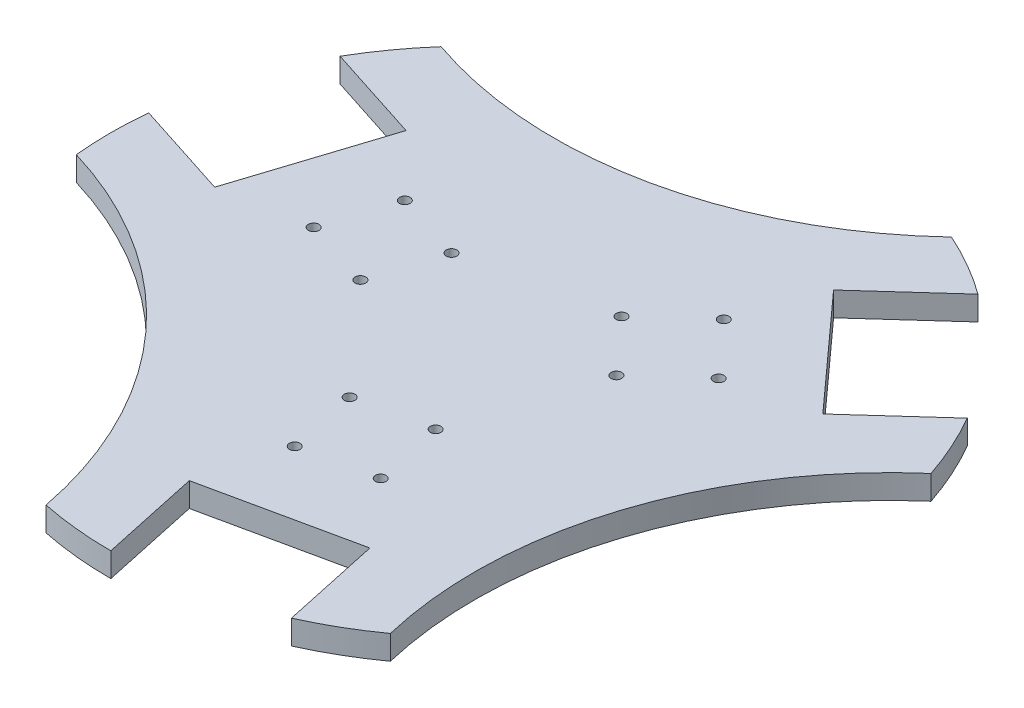
ISO-10303-21;
HEADER;
FILE_DESCRIPTION(('STEP AP214'),'2;1');
FILE_NAME('part.step','',(''),(''),'','','');
FILE_SCHEMA(('AUTOMOTIVE_DESIGN { 1 0 10303 214 1 1 1 1 }'));
ENDSEC;
DATA;
#1=APPLICATION_CONTEXT('core data for automotive mechanical design processes');
#2=APPLICATION_PROTOCOL_DEFINITION('international standard','automotive_design',2000,#1);
#3=PRODUCT_CONTEXT('',#1,'mechanical');
#4=PRODUCT('Part','Part','',(#3));
#5=PRODUCT_RELATED_PRODUCT_CATEGORY('part','',(#4));
#6=PRODUCT_DEFINITION_FORMATION('','',#4);
#7=PRODUCT_DEFINITION_CONTEXT('part definition',#1,'design');
#8=PRODUCT_DEFINITION('design','',#6,#7);
#9=PRODUCT_DEFINITION_SHAPE('','',#8);
#10=(LENGTH_UNIT() NAMED_UNIT(*) SI_UNIT(.MILLI.,.METRE.));
#11=(NAMED_UNIT(*) PLANE_ANGLE_UNIT() SI_UNIT($,.RADIAN.));
#12=(NAMED_UNIT(*) SI_UNIT($,.STERADIAN.) SOLID_ANGLE_UNIT());
#13=UNCERTAINTY_MEASURE_WITH_UNIT(LENGTH_MEASURE(1.E-05),#10,'distance_accuracy_value','');
#14=(GEOMETRIC_REPRESENTATION_CONTEXT(3) GLOBAL_UNCERTAINTY_ASSIGNED_CONTEXT((#13)) GLOBAL_UNIT_ASSIGNED_CONTEXT((#10,
#11,#12)) REPRESENTATION_CONTEXT('',''));
#15=CARTESIAN_POINT('',(0.,0.,0.));
#16=DIRECTION('',(0.,0.,1.));
#17=DIRECTION('',(1.,0.,0.));
#18=AXIS2_PLACEMENT_3D('',#15,#16,#17);
#19=CARTESIAN_POINT('',(254.887392455541,10.,82.1373974798932));
#20=DIRECTION('',(0.,-1.,0.));
#21=DIRECTION('',(0.,0.,-1.));
#22=AXIS2_PLACEMENT_3D('',#19,#20,#21);
#23=PLANE('',#22);
#24=CARTESIAN_POINT('',(254.887392455541,10.,82.1373974798932));
#25=DIRECTION('',(0.,-1.,0.));
#26=DIRECTION('',(0.,0.,-1.));
#27=AXIS2_PLACEMENT_3D('',#24,#25,#26);
#28=CIRCLE('',#27,171.9);
#29=CARTESIAN_POINT('',(87.6144388397631,10.,121.752659547105));
#30=VERTEX_POINT('',#29);
#31=CARTESIAN_POINT('',(142.217130056094,10.,-47.689494845387));
#32=VERTEX_POINT('',#31);
#33=EDGE_CURVE('E225',#30,#32,#28,.T.);
#34=ORIENTED_EDGE('',*,*,#33,.T.);
#35=CARTESIAN_POINT('',(0.,10.,0.));
#36=DIRECTION('',(0.,1.,0.));
#37=DIRECTION('',(0.,0.,1.));
#38=AXIS2_PLACEMENT_3D('',#35,#36,#37);
#39=CIRCLE('',#38,150.);
#40=CARTESIAN_POINT('',(129.882697804348,10.,-75.0365564979135));
#41=VERTEX_POINT('',#40);
#42=EDGE_CURVE('E123',#32,#41,#39,.T.);
#43=ORIENTED_EDGE('',*,*,#42,.T.);
#44=DIRECTION('',(-0.741525445225282,0.,0.6709247454696));
#45=VECTOR('',#44,1.);
#46=CARTESIAN_POINT('',(98.4642646901526,10.,-46.6094750323666));
#47=LINE('',#46,#45);
#48=CARTESIAN_POINT('',(98.4642646901526,10.,-46.6094750323666));
#49=VERTEX_POINT('',#48);
#50=EDGE_CURVE('E270',#41,#49,#47,.T.);
#51=ORIENTED_EDGE('',*,*,#50,.T.);
#52=DIRECTION('',(-0.6709247454696,0.,-0.741525445225282));
#53=VECTOR('',#52,1.);
#54=CARTESIAN_POINT('',(56.1960057255678,10.,-93.3255780815594));
#55=LINE('',#54,#53);
#56=CARTESIAN_POINT('',(56.1960057255678,10.,-93.3255780815594));
#57=VERTEX_POINT('',#56);
#58=EDGE_CURVE('E289',#49,#57,#55,.T.);
#59=ORIENTED_EDGE('',*,*,#58,.T.);
#60=DIRECTION('',(0.741525445225282,0.,-0.6709247454696));
#61=VECTOR('',#60,1.);
#62=CARTESIAN_POINT('',(87.614438839763,10.,-121.752659547106));
#63=LINE('',#62,#61);
#64=CARTESIAN_POINT('',(87.614438839763,10.,-121.752659547106));
#65=VERTEX_POINT('',#64);
#66=EDGE_CURVE('E286',#57,#65,#63,.T.);
#67=ORIENTED_EDGE('',*,*,#66,.T.);
#68=CARTESIAN_POINT('',(0.,10.,0.));
#69=DIRECTION('',(0.,1.,0.));
#70=DIRECTION('',(0.,0.,1.));
#71=AXIS2_PLACEMENT_3D('',#68,#69,#70);
#72=CIRCLE('',#71,150.000000000001);
#73=CARTESIAN_POINT('',(61.6336767262298,10.,-136.752659547106));
#74=VERTEX_POINT('',#73);
#75=EDGE_CURVE('E288',#65,#74,#72,.T.);
#76=ORIENTED_EDGE('',*,*,#75,.T.);
#77=CARTESIAN_POINT('',(-56.3106234094427,10.,-261.807655710819));
#78=DIRECTION('',(0.,-1.,0.));
#79=DIRECTION('',(0.,0.,1.));
#80=AXIS2_PLACEMENT_3D('',#77,#78,#79);
#81=CIRCLE('',#80,171.9);
#82=CARTESIAN_POINT('',(-112.408879057798,10.,-99.3189000592));
#83=VERTEX_POINT('',#82);
#84=EDGE_CURVE('E291',#74,#83,#81,.T.);
#85=ORIENTED_EDGE('',*,*,#84,.T.);
#86=CARTESIAN_POINT('',(0.,10.,0.));
#87=DIRECTION('',(0.,1.,0.));
#88=DIRECTION('',(0.,0.,1.));
#89=AXIS2_PLACEMENT_3D('',#86,#87,#88);
#90=CIRCLE('',#89,150.);
#91=CARTESIAN_POINT('',(-129.924913041873,10.,-74.9634375616666));
#92=VERTEX_POINT('',#91);
#93=EDGE_CURVE('E297',#83,#92,#90,.T.);
#94=ORIENTED_EDGE('',*,*,#93,.T.);
#95=DIRECTION('',(0.951800596216923,0.,0.306717500382859));
#96=VECTOR('',#95,1.);
#97=CARTESIAN_POINT('',(-89.5971217801617,10.,-61.9678170704449));
#98=LINE('',#97,#96);
#99=CARTESIAN_POINT('',(-89.5971217801617,10.,-61.9678170704449));
#100=VERTEX_POINT('',#99);
#101=EDGE_CURVE('E299',#92,#100,#98,.T.);
#102=ORIENTED_EDGE('',*,*,#101,.T.);
#103=DIRECTION('',(-0.306717500382859,0.,0.951800596216923));
#104=VECTOR('',#103,1.);
#105=CARTESIAN_POINT('',(-108.920324304282,10.,-2.00437950877862));
#106=LINE('',#105,#104);
#107=CARTESIAN_POINT('',(-108.920324304282,10.,-2.00437950877862));
#108=VERTEX_POINT('',#107);
#109=EDGE_CURVE('E301',#100,#108,#106,.T.);
#110=ORIENTED_EDGE('',*,*,#109,.T.);
#111=DIRECTION('',(-0.951800596216923,0.,-0.306717500382861));
#112=VECTOR('',#111,1.);
#113=CARTESIAN_POINT('',(-149.248115565993,10.,-15.0000000000004));
#114=LINE('',#113,#112);
#115=CARTESIAN_POINT('',(-149.248115565993,10.,-15.0000000000005));
#116=VERTEX_POINT('',#115);
#117=EDGE_CURVE('E303',#108,#116,#114,.T.);
#118=ORIENTED_EDGE('',*,*,#117,.T.);
#119=CARTESIAN_POINT('',(0.,10.,0.));
#120=DIRECTION('',(0.,1.,0.));
#121=DIRECTION('',(0.,0.,1.));
#122=AXIS2_PLACEMENT_3D('',#119,#120,#121);
#123=CIRCLE('',#122,150.);
#124=CARTESIAN_POINT('',(-149.248115565993,10.,14.9999999999995));
#125=VERTEX_POINT('',#124);
#126=EDGE_CURVE('E305',#116,#125,#123,.T.);
#127=ORIENTED_EDGE('',*,*,#126,.T.);
#128=CARTESIAN_POINT('',(-198.576769046098,10.,179.670258230926));
#129=DIRECTION('',(0.,-1.,0.));
#130=DIRECTION('',(0.,0.,1.));
#131=AXIS2_PLACEMENT_3D('',#128,#129,#130);
#132=CIRCLE('',#131,171.9);
#133=CARTESIAN_POINT('',(-29.8082509982954,10.,147.008394904585));
#134=VERTEX_POINT('',#133);
#135=EDGE_CURVE('E307',#125,#134,#132,.T.);
#136=ORIENTED_EDGE('',*,*,#135,.T.);
#137=CARTESIAN_POINT('',(0.,10.,0.));
#138=DIRECTION('',(0.,1.,0.));
#139=DIRECTION('',(0.,0.,1.));
#140=AXIS2_PLACEMENT_3D('',#137,#138,#139);
#141=CIRCLE('',#140,149.999999999999);
#142=CARTESIAN_POINT('',(0.0422152375249344,10.,149.999994059578));
#143=VERTEX_POINT('',#142);
#144=EDGE_CURVE('E309',#134,#143,#141,.T.);
#145=ORIENTED_EDGE('',*,*,#144,.T.);
#146=DIRECTION('',(-0.21027515099164,0.,-0.97764224585246));
#147=VECTOR('',#146,1.);
#148=CARTESIAN_POINT('',(0.0422152375249344,10.,149.999994059578));
#149=LINE('',#148,#147);
#150=CARTESIAN_POINT('',(-8.86714290999087,10.,108.57729210281));
#151=VERTEX_POINT('',#150);
#152=EDGE_CURVE('E172',#143,#151,#149,.T.);
#153=ORIENTED_EDGE('',*,*,#152,.T.);
#154=DIRECTION('',(0.977642245852461,0.,-0.21027515099164));
#155=VECTOR('',#154,1.);
#156=CARTESIAN_POINT('',(-8.86714290999087,10.,108.57729210281));
#157=LINE('',#156,#155);
#158=CARTESIAN_POINT('',(52.7243185787141,10.,95.3299575903362));
#159=VERTEX_POINT('',#158);
#160=EDGE_CURVE('E166',#151,#159,#157,.T.);
#161=ORIENTED_EDGE('',*,*,#160,.T.);
#162=DIRECTION('',(0.21027515099164,0.,0.977642245852461));
#163=VECTOR('',#162,1.);
#164=CARTESIAN_POINT('',(52.7243185787141,10.,95.3299575903362));
#165=LINE('',#164,#163);
#166=CARTESIAN_POINT('',(61.63367672623,10.,136.752659547105));
#167=VERTEX_POINT('',#166);
#168=EDGE_CURVE('E170',#159,#167,#165,.T.);
#169=ORIENTED_EDGE('',*,*,#168,.T.);
#170=CARTESIAN_POINT('',(0.,10.,0.));
#171=DIRECTION('',(0.,1.,0.));
#172=DIRECTION('',(0.,0.,1.));
#173=AXIS2_PLACEMENT_3D('',#170,#171,#172);
#174=CIRCLE('',#173,149.999999999999);
#175=EDGE_CURVE('E50',#167,#30,#174,.T.);
#176=ORIENTED_EDGE('',*,*,#175,.T.);
#177=EDGE_LOOP('',(#34,#43,#51,#59,#67,#76,#85,#94,#102,#110,#118,#127,#136,#145,#153,#161,#169,#176));
#178=FACE_BOUND('',#177,.T.);
#179=CARTESIAN_POINT('',(-5.57103079480401,10.,45.4334470668592));
#180=DIRECTION('',(0.,1.,0.));
#181=DIRECTION('',(0.,0.,1.));
#182=AXIS2_PLACEMENT_3D('',#179,#180,#181);
#183=CIRCLE('',#182,2.19999999999993);
#184=CARTESIAN_POINT('',(-5.57103079480401,10.,47.6334470668591));
#185=VERTEX_POINT('',#184);
#186=EDGE_CURVE('E194',#185,#185,#183,.T.);
#187=ORIENTED_EDGE('',*,*,#186,.F.);
#188=EDGE_LOOP('',(#187));
#189=FACE_BOUND('',#188,.T.);
#190=CARTESIAN_POINT('',(0.663417156947142,10.,74.4195620141388));
#191=DIRECTION('',(0.,1.,0.));
#192=DIRECTION('',(0.,0.,1.));
#193=AXIS2_PLACEMENT_3D('',#190,#191,#192);
#194=CIRCLE('',#193,2.19999999999991);
#195=CARTESIAN_POINT('',(0.663417156947142,10.,76.6195620141387));
#196=VERTEX_POINT('',#195);
#197=EDGE_CURVE('E453',#196,#196,#194,.T.);
#198=ORIENTED_EDGE('',*,*,#197,.F.);
#199=EDGE_LOOP('',(#198));
#200=FACE_BOUND('',#199,.T.);
#201=CARTESIAN_POINT('',(29.992684532521,10.,68.1113074843901));
#202=DIRECTION('',(0.,1.,0.));
#203=DIRECTION('',(0.,0.,-1.));
#204=AXIS2_PLACEMENT_3D('',#201,#202,#203);
#205=CIRCLE('',#204,2.19999999999999);
#206=CARTESIAN_POINT('',(29.992684532521,10.,65.9113074843901));
#207=VERTEX_POINT('',#206);
#208=EDGE_CURVE('E447',#207,#207,#205,.T.);
#209=ORIENTED_EDGE('',*,*,#208,.F.);
#210=EDGE_LOOP('',(#209));
#211=FACE_BOUND('',#210,.T.);
#212=CARTESIAN_POINT('',(23.7582365807699,10.,39.1251925371105));
#213=DIRECTION('',(0.,1.,0.));
#214=DIRECTION('',(0.,0.,-1.));
#215=AXIS2_PLACEMENT_3D('',#212,#213,#214);
#216=CIRCLE('',#215,2.19999999999999);
#217=CARTESIAN_POINT('',(23.7582365807699,10.,36.9251925371105));
#218=VERTEX_POINT('',#217);
#219=EDGE_CURVE('E441',#218,#218,#216,.T.);
#220=ORIENTED_EDGE('',*,*,#219,.F.);
#221=EDGE_LOOP('',(#220));
#222=FACE_BOUND('',#221,.T.);
#223=CARTESIAN_POINT('',(64.1175226642826,10.,-37.784317118293));
#224=DIRECTION('',(0.,1.,0.));
#225=DIRECTION('',(0.,0.,1.));
#226=AXIS2_PLACEMENT_3D('',#223,#224,#225);
#227=CIRCLE('',#226,2.19999999999976);
#228=CARTESIAN_POINT('',(64.1175226642826,10.,-35.5843171182933));
#229=VERTEX_POINT('',#228);
#230=EDGE_CURVE('E435',#229,#229,#227,.T.);
#231=ORIENTED_EDGE('',*,*,#230,.F.);
#232=EDGE_LOOP('',(#231));
#233=FACE_BOUND('',#232,.T.);
#234=CARTESIAN_POINT('',(43.9897803001945,10.,-60.0300804750511));
#235=DIRECTION('',(0.,1.,0.));
#236=DIRECTION('',(0.,0.,-1.));
#237=AXIS2_PLACEMENT_3D('',#234,#235,#236);
#238=CIRCLE('',#237,2.2);
#239=CARTESIAN_POINT('',(43.9897803001945,10.,-62.2300804750511));
#240=VERTEX_POINT('',#239);
#241=EDGE_CURVE('E429',#240,#240,#238,.T.);
#242=ORIENTED_EDGE('',*,*,#241,.F.);
#243=EDGE_LOOP('',(#242));
#244=FACE_BOUND('',#243,.T.);
#245=CARTESIAN_POINT('',(41.871759307524,10.,-17.6565747542046));
#246=DIRECTION('',(0.,1.,0.));
#247=DIRECTION('',(0.,0.,1.));
#248=AXIS2_PLACEMENT_3D('',#245,#246,#247);
#249=CIRCLE('',#248,2.2);
#250=CARTESIAN_POINT('',(41.871759307524,10.,-15.4565747542046));
#251=VERTEX_POINT('',#250);
#252=EDGE_CURVE('E423',#251,#251,#249,.T.);
#253=ORIENTED_EDGE('',*,*,#252,.F.);
#254=EDGE_LOOP('',(#253));
#255=FACE_BOUND('',#254,.T.);
#256=CARTESIAN_POINT('',(21.7440169434361,10.,-39.9023381109631));
#257=DIRECTION('',(0.,1.,0.));
#258=DIRECTION('',(0.,0.,-1.));
#259=AXIS2_PLACEMENT_3D('',#256,#257,#258);
#260=CIRCLE('',#259,2.19999999999998);
#261=CARTESIAN_POINT('',(21.7440169434361,10.,-42.1023381109631));
#262=VERTEX_POINT('',#261);
#263=EDGE_CURVE('E417',#262,#262,#260,.T.);
#264=ORIENTED_EDGE('',*,*,#263,.F.);
#265=EDGE_LOOP('',(#264));
#266=FACE_BOUND('',#265,.T.);
#267=CARTESIAN_POINT('',(-36.226921934722,10.,-27.4337198843619));
#268=DIRECTION('',(0.,1.,0.));
#269=DIRECTION('',(0.,0.,1.));
#270=AXIS2_PLACEMENT_3D('',#267,#268,#269);
#271=CIRCLE('',#270,2.19999999999969);
#272=CARTESIAN_POINT('',(-36.226921934722,10.,-25.2337198843622));
#273=VERTEX_POINT('',#272);
#274=EDGE_CURVE('E411',#273,#273,#271,.T.);
#275=ORIENTED_EDGE('',*,*,#274,.F.);
#276=EDGE_LOOP('',(#275));
#277=FACE_BOUND('',#276,.T.);
#278=CARTESIAN_POINT('',(-64.7809398212297,10.,-36.6352448958477));
#279=DIRECTION('',(0.,1.,0.));
#280=DIRECTION('',(0.,0.,1.));
#281=AXIS2_PLACEMENT_3D('',#278,#279,#280);
#282=CIRCLE('',#281,2.19999999999974);
#283=CARTESIAN_POINT('',(-64.7809398212297,10.,-34.435244895848));
#284=VERTEX_POINT('',#283);
#285=EDGE_CURVE('E405',#284,#284,#282,.T.);
#286=ORIENTED_EDGE('',*,*,#285,.F.);
#287=EDGE_LOOP('',(#286));
#288=FACE_BOUND('',#287,.T.);
#289=CARTESIAN_POINT('',(-73.9824648327156,10.,-8.08122700933939));
#290=DIRECTION('',(0.,1.,0.));
#291=DIRECTION('',(0.,0.,-1.));
#292=AXIS2_PLACEMENT_3D('',#289,#290,#291);
#293=CIRCLE('',#292,2.20000000000001);
#294=CARTESIAN_POINT('',(-73.9824648327156,10.,-10.2812270093394));
#295=VERTEX_POINT('',#294);
#296=EDGE_CURVE('E399',#295,#295,#293,.T.);
#297=ORIENTED_EDGE('',*,*,#296,.F.);
#298=EDGE_LOOP('',(#297));
#299=FACE_BOUND('',#298,.T.);
#300=CARTESIAN_POINT('',(-45.4284469462079,10.,1.1202980021465));
#301=DIRECTION('',(0.,1.,0.));
#302=DIRECTION('',(0.,0.,-1.));
#303=AXIS2_PLACEMENT_3D('',#300,#301,#302);
#304=CIRCLE('',#303,2.19999999999999);
#305=CARTESIAN_POINT('',(-45.4284469462079,10.,-1.07970199785349));
#306=VERTEX_POINT('',#305);
#307=EDGE_CURVE('E390',#306,#306,#304,.T.);
#308=ORIENTED_EDGE('',*,*,#307,.F.);
#309=EDGE_LOOP('',(#308));
#310=FACE_BOUND('',#309,.T.);
#311=ADVANCED_FACE('F33',(#178,#189,#200,#211,#222,#233,#244,#255,#266,#277,#288,#299,#310),#23,.F.);
#312=CARTESIAN_POINT('',(254.887392455541,0.,82.1373974798932));
#313=DIRECTION('',(0.,-1.,0.));
#314=DIRECTION('',(0.,0.,-1.));
#315=AXIS2_PLACEMENT_3D('',#312,#313,#314);
#316=PLANE('',#315);
#317=CARTESIAN_POINT('',(-73.9824648327156,0.,-8.08122700933939));
#318=DIRECTION('',(0.,1.,0.));
#319=DIRECTION('',(0.,0.,-1.));
#320=AXIS2_PLACEMENT_3D('',#317,#318,#319);
#321=CIRCLE('',#320,2.20000000000001);
#322=CARTESIAN_POINT('',(-73.9824648327156,0.,-10.2812270093394));
#323=VERTEX_POINT('',#322);
#324=EDGE_CURVE('E396',#323,#323,#321,.T.);
#325=ORIENTED_EDGE('',*,*,#324,.T.);
#326=EDGE_LOOP('',(#325));
#327=FACE_BOUND('',#326,.T.);
#328=CARTESIAN_POINT('',(-36.226921934722,0.,-27.4337198843619));
#329=DIRECTION('',(0.,1.,0.));
#330=DIRECTION('',(0.,0.,1.));
#331=AXIS2_PLACEMENT_3D('',#328,#329,#330);
#332=CIRCLE('',#331,2.19999999999969);
#333=CARTESIAN_POINT('',(-36.226921934722,0.,-25.2337198843622));
#334=VERTEX_POINT('',#333);
#335=EDGE_CURVE('E408',#334,#334,#332,.T.);
#336=ORIENTED_EDGE('',*,*,#335,.T.);
#337=EDGE_LOOP('',(#336));
#338=FACE_BOUND('',#337,.T.);
#339=CARTESIAN_POINT('',(41.871759307524,0.,-17.6565747542046));
#340=DIRECTION('',(0.,1.,0.));
#341=DIRECTION('',(0.,0.,1.));
#342=AXIS2_PLACEMENT_3D('',#339,#340,#341);
#343=CIRCLE('',#342,2.2);
#344=CARTESIAN_POINT('',(41.871759307524,0.,-15.4565747542046));
#345=VERTEX_POINT('',#344);
#346=EDGE_CURVE('E420',#345,#345,#343,.T.);
#347=ORIENTED_EDGE('',*,*,#346,.T.);
#348=EDGE_LOOP('',(#347));
#349=FACE_BOUND('',#348,.T.);
#350=CARTESIAN_POINT('',(64.1175226642826,0.,-37.784317118293));
#351=DIRECTION('',(0.,1.,0.));
#352=DIRECTION('',(0.,0.,1.));
#353=AXIS2_PLACEMENT_3D('',#350,#351,#352);
#354=CIRCLE('',#353,2.19999999999976);
#355=CARTESIAN_POINT('',(64.1175226642826,0.,-35.5843171182933));
#356=VERTEX_POINT('',#355);
#357=EDGE_CURVE('E432',#356,#356,#354,.T.);
#358=ORIENTED_EDGE('',*,*,#357,.T.);
#359=EDGE_LOOP('',(#358));
#360=FACE_BOUND('',#359,.T.);
#361=CARTESIAN_POINT('',(29.992684532521,0.,68.1113074843901));
#362=DIRECTION('',(0.,1.,0.));
#363=DIRECTION('',(0.,0.,-1.));
#364=AXIS2_PLACEMENT_3D('',#361,#362,#363);
#365=CIRCLE('',#364,2.19999999999999);
#366=CARTESIAN_POINT('',(29.992684532521,0.,65.9113074843901));
#367=VERTEX_POINT('',#366);
#368=EDGE_CURVE('E444',#367,#367,#365,.T.);
#369=ORIENTED_EDGE('',*,*,#368,.T.);
#370=EDGE_LOOP('',(#369));
#371=FACE_BOUND('',#370,.T.);
#372=CARTESIAN_POINT('',(-5.57103079480401,0.,45.4334470668592));
#373=DIRECTION('',(0.,1.,0.));
#374=DIRECTION('',(0.,0.,1.));
#375=AXIS2_PLACEMENT_3D('',#372,#373,#374);
#376=CIRCLE('',#375,2.19999999999993);
#377=CARTESIAN_POINT('',(-5.57103079480401,0.,47.6334470668591));
#378=VERTEX_POINT('',#377);
#379=EDGE_CURVE('E456',#378,#378,#376,.T.);
#380=ORIENTED_EDGE('',*,*,#379,.T.);
#381=EDGE_LOOP('',(#380));
#382=FACE_BOUND('',#381,.T.);
#383=CARTESIAN_POINT('',(254.887392455541,0.,82.1373974798932));
#384=DIRECTION('',(0.,-1.,0.));
#385=DIRECTION('',(0.,0.,-1.));
#386=AXIS2_PLACEMENT_3D('',#383,#384,#385);
#387=CIRCLE('',#386,171.9);
#388=CARTESIAN_POINT('',(87.6144388397631,0.,121.752659547105));
#389=VERTEX_POINT('',#388);
#390=CARTESIAN_POINT('',(142.217130056094,0.,-47.689494845387));
#391=VERTEX_POINT('',#390);
#392=EDGE_CURVE('E190',#389,#391,#387,.T.);
#393=ORIENTED_EDGE('',*,*,#392,.F.);
#394=CARTESIAN_POINT('',(0.,0.,0.));
#395=DIRECTION('',(0.,1.,0.));
#396=DIRECTION('',(0.,0.,1.));
#397=AXIS2_PLACEMENT_3D('',#394,#395,#396);
#398=CIRCLE('',#397,149.999999999999);
#399=CARTESIAN_POINT('',(61.63367672623,0.,136.752659547105));
#400=VERTEX_POINT('',#399);
#401=EDGE_CURVE('E115',#400,#389,#398,.T.);
#402=ORIENTED_EDGE('',*,*,#401,.F.);
#403=DIRECTION('',(0.21027515099164,0.,0.977642245852461));
#404=VECTOR('',#403,1.);
#405=CARTESIAN_POINT('',(52.7243185787141,0.,95.3299575903362));
#406=LINE('',#405,#404);
#407=CARTESIAN_POINT('',(52.7243185787141,0.,95.3299575903362));
#408=VERTEX_POINT('',#407);
#409=EDGE_CURVE('E109',#408,#400,#406,.T.);
#410=ORIENTED_EDGE('',*,*,#409,.F.);
#411=DIRECTION('',(0.977642245852461,0.,-0.21027515099164));
#412=VECTOR('',#411,1.);
#413=CARTESIAN_POINT('',(-8.86714290999087,0.,108.57729210281));
#414=LINE('',#413,#412);
#415=CARTESIAN_POINT('',(-8.86714290999087,0.,108.57729210281));
#416=VERTEX_POINT('',#415);
#417=EDGE_CURVE('E180',#416,#408,#414,.T.);
#418=ORIENTED_EDGE('',*,*,#417,.F.);
#419=DIRECTION('',(-0.21027515099164,0.,-0.97764224585246));
#420=VECTOR('',#419,1.);
#421=CARTESIAN_POINT('',(0.0422152375249344,0.,149.999994059578));
#422=LINE('',#421,#420);
#423=CARTESIAN_POINT('',(0.0422152375249344,0.,149.999994059578));
#424=VERTEX_POINT('',#423);
#425=EDGE_CURVE('E220',#424,#416,#422,.T.);
#426=ORIENTED_EDGE('',*,*,#425,.F.);
#427=CARTESIAN_POINT('',(0.,0.,0.));
#428=DIRECTION('',(0.,1.,0.));
#429=DIRECTION('',(0.,0.,1.));
#430=AXIS2_PLACEMENT_3D('',#427,#428,#429);
#431=CIRCLE('',#430,149.999999999999);
#432=CARTESIAN_POINT('',(-29.8082509982954,0.,147.008394904585));
#433=VERTEX_POINT('',#432);
#434=EDGE_CURVE('E218',#433,#424,#431,.T.);
#435=ORIENTED_EDGE('',*,*,#434,.F.);
#436=CARTESIAN_POINT('',(-198.576769046098,0.,179.670258230926));
#437=DIRECTION('',(0.,-1.,0.));
#438=DIRECTION('',(0.,0.,1.));
#439=AXIS2_PLACEMENT_3D('',#436,#437,#438);
#440=CIRCLE('',#439,171.9);
#441=CARTESIAN_POINT('',(-149.248115565993,0.,14.9999999999995));
#442=VERTEX_POINT('',#441);
#443=EDGE_CURVE('E216',#442,#433,#440,.T.);
#444=ORIENTED_EDGE('',*,*,#443,.F.);
#445=CARTESIAN_POINT('',(0.,0.,0.));
#446=DIRECTION('',(0.,1.,0.));
#447=DIRECTION('',(0.,0.,1.));
#448=AXIS2_PLACEMENT_3D('',#445,#446,#447);
#449=CIRCLE('',#448,150.);
#450=CARTESIAN_POINT('',(-149.248115565993,0.,-15.0000000000005));
#451=VERTEX_POINT('',#450);
#452=EDGE_CURVE('E214',#451,#442,#449,.T.);
#453=ORIENTED_EDGE('',*,*,#452,.F.);
#454=DIRECTION('',(-0.951800596216923,0.,-0.306717500382861));
#455=VECTOR('',#454,1.);
#456=CARTESIAN_POINT('',(-149.248115565993,0.,-15.0000000000004));
#457=LINE('',#456,#455);
#458=CARTESIAN_POINT('',(-108.920324304282,0.,-2.00437950877862));
#459=VERTEX_POINT('',#458);
#460=EDGE_CURVE('E212',#459,#451,#457,.T.);
#461=ORIENTED_EDGE('',*,*,#460,.F.);
#462=DIRECTION('',(-0.306717500382859,0.,0.951800596216923));
#463=VECTOR('',#462,1.);
#464=CARTESIAN_POINT('',(-108.920324304282,0.,-2.00437950877862));
#465=LINE('',#464,#463);
#466=CARTESIAN_POINT('',(-89.5971217801617,0.,-61.9678170704449));
#467=VERTEX_POINT('',#466);
#468=EDGE_CURVE('E210',#467,#459,#465,.T.);
#469=ORIENTED_EDGE('',*,*,#468,.F.);
#470=DIRECTION('',(0.951800596216923,0.,0.306717500382859));
#471=VECTOR('',#470,1.);
#472=CARTESIAN_POINT('',(-89.5971217801617,0.,-61.9678170704449));
#473=LINE('',#472,#471);
#474=CARTESIAN_POINT('',(-129.924913041873,0.,-74.9634375616666));
#475=VERTEX_POINT('',#474);
#476=EDGE_CURVE('E208',#475,#467,#473,.T.);
#477=ORIENTED_EDGE('',*,*,#476,.F.);
#478=CARTESIAN_POINT('',(0.,0.,0.));
#479=DIRECTION('',(0.,1.,0.));
#480=DIRECTION('',(0.,0.,1.));
#481=AXIS2_PLACEMENT_3D('',#478,#479,#480);
#482=CIRCLE('',#481,150.);
#483=CARTESIAN_POINT('',(-112.408879057798,0.,-99.3189000592));
#484=VERTEX_POINT('',#483);
#485=EDGE_CURVE('E206',#484,#475,#482,.T.);
#486=ORIENTED_EDGE('',*,*,#485,.F.);
#487=CARTESIAN_POINT('',(-56.3106234094427,0.,-261.807655710819));
#488=DIRECTION('',(0.,-1.,0.));
#489=DIRECTION('',(0.,0.,1.));
#490=AXIS2_PLACEMENT_3D('',#487,#488,#489);
#491=CIRCLE('',#490,171.9);
#492=CARTESIAN_POINT('',(61.6336767262298,0.,-136.752659547106));
#493=VERTEX_POINT('',#492);
#494=EDGE_CURVE('E204',#493,#484,#491,.T.);
#495=ORIENTED_EDGE('',*,*,#494,.F.);
#496=CARTESIAN_POINT('',(0.,0.,0.));
#497=DIRECTION('',(0.,1.,0.));
#498=DIRECTION('',(0.,0.,1.));
#499=AXIS2_PLACEMENT_3D('',#496,#497,#498);
#500=CIRCLE('',#499,150.000000000001);
#501=CARTESIAN_POINT('',(87.614438839763,0.,-121.752659547106));
#502=VERTEX_POINT('',#501);
#503=EDGE_CURVE('E202',#502,#493,#500,.T.);
#504=ORIENTED_EDGE('',*,*,#503,.F.);
#505=DIRECTION('',(0.741525445225282,0.,-0.6709247454696));
#506=VECTOR('',#505,1.);
#507=CARTESIAN_POINT('',(87.614438839763,0.,-121.752659547106));
#508=LINE('',#507,#506);
#509=CARTESIAN_POINT('',(56.1960057255678,0.,-93.3255780815594));
#510=VERTEX_POINT('',#509);
#511=EDGE_CURVE('E200',#510,#502,#508,.T.);
#512=ORIENTED_EDGE('',*,*,#511,.F.);
#513=DIRECTION('',(-0.6709247454696,0.,-0.741525445225282));
#514=VECTOR('',#513,1.);
#515=CARTESIAN_POINT('',(56.1960057255678,0.,-93.3255780815594));
#516=LINE('',#515,#514);
#517=CARTESIAN_POINT('',(98.4642646901526,0.,-46.6094750323666));
#518=VERTEX_POINT('',#517);
#519=EDGE_CURVE('E198',#518,#510,#516,.T.);
#520=ORIENTED_EDGE('',*,*,#519,.F.);
#521=DIRECTION('',(-0.741525445225282,0.,0.6709247454696));
#522=VECTOR('',#521,1.);
#523=CARTESIAN_POINT('',(98.4642646901526,0.,-46.6094750323666));
#524=LINE('',#523,#522);
#525=CARTESIAN_POINT('',(129.882697804348,0.,-75.0365564979135));
#526=VERTEX_POINT('',#525);
#527=EDGE_CURVE('E196',#526,#518,#524,.T.);
#528=ORIENTED_EDGE('',*,*,#527,.F.);
#529=CARTESIAN_POINT('',(0.,0.,0.));
#530=DIRECTION('',(0.,1.,0.));
#531=DIRECTION('',(0.,0.,1.));
#532=AXIS2_PLACEMENT_3D('',#529,#530,#531);
#533=CIRCLE('',#532,150.);
#534=EDGE_CURVE('E193',#391,#526,#533,.T.);
#535=ORIENTED_EDGE('',*,*,#534,.F.);
#536=EDGE_LOOP('',(#393,#402,#410,#418,#426,#435,#444,#453,#461,#469,#477,#486,#495,#504,#512,
#520,#528,#535));
#537=FACE_BOUND('',#536,.T.);
#538=CARTESIAN_POINT('',(0.663417156947142,0.,74.4195620141388));
#539=DIRECTION('',(0.,1.,0.));
#540=DIRECTION('',(0.,0.,1.));
#541=AXIS2_PLACEMENT_3D('',#538,#539,#540);
#542=CIRCLE('',#541,2.19999999999991);
#543=CARTESIAN_POINT('',(0.663417156947142,0.,76.6195620141387));
#544=VERTEX_POINT('',#543);
#545=EDGE_CURVE('E450',#544,#544,#542,.T.);
#546=ORIENTED_EDGE('',*,*,#545,.T.);
#547=EDGE_LOOP('',(#546));
#548=FACE_BOUND('',#547,.T.);
#549=CARTESIAN_POINT('',(23.7582365807699,0.,39.1251925371105));
#550=DIRECTION('',(0.,1.,0.));
#551=DIRECTION('',(0.,0.,-1.));
#552=AXIS2_PLACEMENT_3D('',#549,#550,#551);
#553=CIRCLE('',#552,2.19999999999999);
#554=CARTESIAN_POINT('',(23.7582365807699,0.,36.9251925371105));
#555=VERTEX_POINT('',#554);
#556=EDGE_CURVE('E438',#555,#555,#553,.T.);
#557=ORIENTED_EDGE('',*,*,#556,.T.);
#558=EDGE_LOOP('',(#557));
#559=FACE_BOUND('',#558,.T.);
#560=CARTESIAN_POINT('',(43.9897803001945,0.,-60.0300804750511));
#561=DIRECTION('',(0.,1.,0.));
#562=DIRECTION('',(0.,0.,-1.));
#563=AXIS2_PLACEMENT_3D('',#560,#561,#562);
#564=CIRCLE('',#563,2.2);
#565=CARTESIAN_POINT('',(43.9897803001945,0.,-62.2300804750511));
#566=VERTEX_POINT('',#565);
#567=EDGE_CURVE('E426',#566,#566,#564,.T.);
#568=ORIENTED_EDGE('',*,*,#567,.T.);
#569=EDGE_LOOP('',(#568));
#570=FACE_BOUND('',#569,.T.);
#571=CARTESIAN_POINT('',(21.7440169434361,0.,-39.9023381109631));
#572=DIRECTION('',(0.,1.,0.));
#573=DIRECTION('',(0.,0.,-1.));
#574=AXIS2_PLACEMENT_3D('',#571,#572,#573);
#575=CIRCLE('',#574,2.19999999999998);
#576=CARTESIAN_POINT('',(21.7440169434361,0.,-42.1023381109631));
#577=VERTEX_POINT('',#576);
#578=EDGE_CURVE('E414',#577,#577,#575,.T.);
#579=ORIENTED_EDGE('',*,*,#578,.T.);
#580=EDGE_LOOP('',(#579));
#581=FACE_BOUND('',#580,.T.);
#582=CARTESIAN_POINT('',(-64.7809398212297,0.,-36.6352448958477));
#583=DIRECTION('',(0.,1.,0.));
#584=DIRECTION('',(0.,0.,1.));
#585=AXIS2_PLACEMENT_3D('',#582,#583,#584);
#586=CIRCLE('',#585,2.19999999999974);
#587=CARTESIAN_POINT('',(-64.7809398212297,0.,-34.435244895848));
#588=VERTEX_POINT('',#587);
#589=EDGE_CURVE('E402',#588,#588,#586,.T.);
#590=ORIENTED_EDGE('',*,*,#589,.T.);
#591=EDGE_LOOP('',(#590));
#592=FACE_BOUND('',#591,.T.);
#593=CARTESIAN_POINT('',(-45.4284469462079,0.,1.1202980021465));
#594=DIRECTION('',(0.,1.,0.));
#595=DIRECTION('',(0.,0.,-1.));
#596=AXIS2_PLACEMENT_3D('',#593,#594,#595);
#597=CIRCLE('',#596,2.19999999999999);
#598=CARTESIAN_POINT('',(-45.4284469462079,0.,-1.07970199785349));
#599=VERTEX_POINT('',#598);
#600=EDGE_CURVE('E393',#599,#599,#597,.T.);
#601=ORIENTED_EDGE('',*,*,#600,.T.);
#602=EDGE_LOOP('',(#601));
#603=FACE_BOUND('',#602,.T.);
#604=ADVANCED_FACE('F274',(#327,#338,#349,#360,#371,#382,#537,#548,#559,#570,#581,#592,#603),
#316,.T.);
#605=CARTESIAN_POINT('',(254.887392455541,10.,82.1373974798932));
#606=DIRECTION('',(0.,-1.,0.));
#607=DIRECTION('',(0.,0.,-1.));
#608=AXIS2_PLACEMENT_3D('',#605,#606,#607);
#609=CYLINDRICAL_SURFACE('',#608,171.9);
#610=ORIENTED_EDGE('',*,*,#392,.T.);
#611=DIRECTION('',(0.,-1.,0.));
#612=VECTOR('',#611,1.);
#613=CARTESIAN_POINT('',(142.217130056094,10.,-47.689494845387));
#614=LINE('',#613,#612);
#615=EDGE_CURVE('E11',#32,#391,#614,.T.);
#616=ORIENTED_EDGE('',*,*,#615,.F.);
#617=ORIENTED_EDGE('',*,*,#33,.F.);
#618=DIRECTION('',(0.,-1.,0.));
#619=VECTOR('',#618,1.);
#620=CARTESIAN_POINT('',(87.6144388397631,10.,121.752659547105));
#621=LINE('',#620,#619);
#622=EDGE_CURVE('E186',#30,#389,#621,.T.);
#623=ORIENTED_EDGE('',*,*,#622,.T.);
#624=EDGE_LOOP('',(#610,#616,#617,#623));
#625=FACE_BOUND('',#624,.T.);
#626=ADVANCED_FACE('F35',(#625),#609,.F.);
#627=CARTESIAN_POINT('',(0.,10.,0.));
#628=DIRECTION('',(0.,-1.,0.));
#629=DIRECTION('',(0.,0.,-1.));
#630=AXIS2_PLACEMENT_3D('',#627,#628,#629);
#631=CYLINDRICAL_SURFACE('',#630,150.);
#632=ORIENTED_EDGE('',*,*,#534,.T.);
#633=DIRECTION('',(0.,-1.,0.));
#634=VECTOR('',#633,1.);
#635=CARTESIAN_POINT('',(129.882697804348,10.,-75.0365564979135));
#636=LINE('',#635,#634);
#637=EDGE_CURVE('E42',#41,#526,#636,.T.);
#638=ORIENTED_EDGE('',*,*,#637,.F.);
#639=ORIENTED_EDGE('',*,*,#42,.F.);
#640=ORIENTED_EDGE('',*,*,#615,.T.);
#641=EDGE_LOOP('',(#632,#638,#639,#640));
#642=FACE_BOUND('',#641,.T.);
#643=ADVANCED_FACE('F700',(#642),#631,.T.);
#644=CARTESIAN_POINT('',(98.4642646901526,10.,-46.6094750323666));
#645=DIRECTION('',(0.6709247454696,0.,0.741525445225282));
#646=DIRECTION('',(0.741525445225282,0.,-0.6709247454696));
#647=AXIS2_PLACEMENT_3D('',#644,#645,#646);
#648=PLANE('',#647);
#649=ORIENTED_EDGE('',*,*,#527,.T.);
#650=DIRECTION('',(0.,-1.,0.));
#651=VECTOR('',#650,1.);
#652=CARTESIAN_POINT('',(98.4642646901526,10.,-46.6094750323666));
#653=LINE('',#652,#651);
#654=EDGE_CURVE('E262',#49,#518,#653,.T.);
#655=ORIENTED_EDGE('',*,*,#654,.F.);
#656=ORIENTED_EDGE('',*,*,#50,.F.);
#657=ORIENTED_EDGE('',*,*,#637,.T.);
#658=EDGE_LOOP('',(#649,#655,#656,#657));
#659=FACE_BOUND('',#658,.T.);
#660=ADVANCED_FACE('F268',(#659),#648,.F.);
#661=CARTESIAN_POINT('',(56.1960057255678,10.,-93.3255780815594));
#662=DIRECTION('',(-0.741525445225282,0.,0.6709247454696));
#663=DIRECTION('',(0.6709247454696,0.,0.741525445225282));
#664=AXIS2_PLACEMENT_3D('',#661,#662,#663);
#665=PLANE('',#664);
#666=ORIENTED_EDGE('',*,*,#519,.T.);
#667=DIRECTION('',(0.,-1.,0.));
#668=VECTOR('',#667,1.);
#669=CARTESIAN_POINT('',(56.1960057255678,10.,-93.3255780815594));
#670=LINE('',#669,#668);
#671=EDGE_CURVE('E259',#57,#510,#670,.T.);
#672=ORIENTED_EDGE('',*,*,#671,.F.);
#673=ORIENTED_EDGE('',*,*,#58,.F.);
#674=ORIENTED_EDGE('',*,*,#654,.T.);
#675=EDGE_LOOP('',(#666,#672,#673,#674));
#676=FACE_BOUND('',#675,.T.);
#677=ADVANCED_FACE('F280',(#676),#665,.F.);
#678=CARTESIAN_POINT('',(87.614438839763,10.,-121.752659547106));
#679=DIRECTION('',(-0.6709247454696,0.,-0.741525445225282));
#680=DIRECTION('',(-0.741525445225282,0.,0.6709247454696));
#681=AXIS2_PLACEMENT_3D('',#678,#679,#680);
#682=PLANE('',#681);
#683=ORIENTED_EDGE('',*,*,#511,.T.);
#684=DIRECTION('',(0.,-1.,0.));
#685=VECTOR('',#684,1.);
#686=CARTESIAN_POINT('',(87.614438839763,10.,-121.752659547106));
#687=LINE('',#686,#685);
#688=EDGE_CURVE('E256',#65,#502,#687,.T.);
#689=ORIENTED_EDGE('',*,*,#688,.F.);
#690=ORIENTED_EDGE('',*,*,#66,.F.);
#691=ORIENTED_EDGE('',*,*,#671,.T.);
#692=EDGE_LOOP('',(#683,#689,#690,#691));
#693=FACE_BOUND('',#692,.T.);
#694=ADVANCED_FACE('F284',(#693),#682,.F.);
#695=CARTESIAN_POINT('',(0.,10.,0.));
#696=DIRECTION('',(0.,-1.,0.));
#697=DIRECTION('',(0.,0.,-1.));
#698=AXIS2_PLACEMENT_3D('',#695,#696,#697);
#699=CYLINDRICAL_SURFACE('',#698,150.000000000001);
#700=ORIENTED_EDGE('',*,*,#503,.T.);
#701=DIRECTION('',(0.,-1.,0.));
#702=VECTOR('',#701,1.);
#703=CARTESIAN_POINT('',(61.6336767262298,10.,-136.752659547106));
#704=LINE('',#703,#702);
#705=EDGE_CURVE('E253',#74,#493,#704,.T.);
#706=ORIENTED_EDGE('',*,*,#705,.F.);
#707=ORIENTED_EDGE('',*,*,#75,.F.);
#708=ORIENTED_EDGE('',*,*,#688,.T.);
#709=EDGE_LOOP('',(#700,#706,#707,#708));
#710=FACE_BOUND('',#709,.T.);
#711=ADVANCED_FACE('F665',(#710),#699,.T.);
#712=CARTESIAN_POINT('',(-56.3106234094427,10.,-261.807655710819));
#713=DIRECTION('',(0.,-1.,0.));
#714=DIRECTION('',(0.,0.,-1.));
#715=AXIS2_PLACEMENT_3D('',#712,#713,#714);
#716=CYLINDRICAL_SURFACE('',#715,171.9);
#717=ORIENTED_EDGE('',*,*,#494,.T.);
#718=DIRECTION('',(0.,-1.,0.));
#719=VECTOR('',#718,1.);
#720=CARTESIAN_POINT('',(-112.408879057798,10.,-99.3189000592));
#721=LINE('',#720,#719);
#722=EDGE_CURVE('E250',#83,#484,#721,.T.);
#723=ORIENTED_EDGE('',*,*,#722,.F.);
#724=ORIENTED_EDGE('',*,*,#84,.F.);
#725=ORIENTED_EDGE('',*,*,#705,.T.);
#726=EDGE_LOOP('',(#717,#723,#724,#725));
#727=FACE_BOUND('',#726,.T.);
#728=ADVANCED_FACE('F655',(#727),#716,.F.);
#729=CARTESIAN_POINT('',(0.,10.,0.));
#730=DIRECTION('',(0.,-1.,0.));
#731=DIRECTION('',(0.,0.,-1.));
#732=AXIS2_PLACEMENT_3D('',#729,#730,#731);
#733=CYLINDRICAL_SURFACE('',#732,150.);
#734=ORIENTED_EDGE('',*,*,#485,.T.);
#735=DIRECTION('',(0.,-1.,0.));
#736=VECTOR('',#735,1.);
#737=CARTESIAN_POINT('',(-129.924913041873,10.,-74.9634375616666));
#738=LINE('',#737,#736);
#739=EDGE_CURVE('E247',#92,#475,#738,.T.);
#740=ORIENTED_EDGE('',*,*,#739,.F.);
#741=ORIENTED_EDGE('',*,*,#93,.F.);
#742=ORIENTED_EDGE('',*,*,#722,.T.);
#743=EDGE_LOOP('',(#734,#740,#741,#742));
#744=FACE_BOUND('',#743,.T.);
#745=ADVANCED_FACE('F645',(#744),#733,.T.);
#746=CARTESIAN_POINT('',(-89.5971217801617,10.,-61.9678170704449));
#747=DIRECTION('',(0.306717500382859,0.,-0.951800596216924));
#748=DIRECTION('',(-0.951800596216924,0.,-0.306717500382859));
#749=AXIS2_PLACEMENT_3D('',#746,#747,#748);
#750=PLANE('',#749);
#751=ORIENTED_EDGE('',*,*,#476,.T.);
#752=DIRECTION('',(0.,-1.,0.));
#753=VECTOR('',#752,1.);
#754=CARTESIAN_POINT('',(-89.5971217801617,10.,-61.9678170704449));
#755=LINE('',#754,#753);
#756=EDGE_CURVE('E244',#100,#467,#755,.T.);
#757=ORIENTED_EDGE('',*,*,#756,.F.);
#758=ORIENTED_EDGE('',*,*,#101,.F.);
#759=ORIENTED_EDGE('',*,*,#739,.T.);
#760=EDGE_LOOP('',(#751,#757,#758,#759));
#761=FACE_BOUND('',#760,.T.);
#762=ADVANCED_FACE('F635',(#761),#750,.F.);
#763=CARTESIAN_POINT('',(-108.920324304282,10.,-2.00437950877862));
#764=DIRECTION('',(0.951800596216923,0.,0.306717500382859));
#765=DIRECTION('',(0.306717500382859,0.,-0.951800596216923));
#766=AXIS2_PLACEMENT_3D('',#763,#764,#765);
#767=PLANE('',#766);
#768=ORIENTED_EDGE('',*,*,#468,.T.);
#769=DIRECTION('',(0.,-1.,0.));
#770=VECTOR('',#769,1.);
#771=CARTESIAN_POINT('',(-108.920324304282,10.,-2.00437950877862));
#772=LINE('',#771,#770);
#773=EDGE_CURVE('E241',#108,#459,#772,.T.);
#774=ORIENTED_EDGE('',*,*,#773,.F.);
#775=ORIENTED_EDGE('',*,*,#109,.F.);
#776=ORIENTED_EDGE('',*,*,#756,.T.);
#777=EDGE_LOOP('',(#768,#774,#775,#776));
#778=FACE_BOUND('',#777,.T.);
#779=ADVANCED_FACE('F625',(#778),#767,.F.);
#780=CARTESIAN_POINT('',(-149.248115565993,10.,-15.0000000000004));
#781=DIRECTION('',(-0.306717500382861,0.,0.951800596216923));
#782=DIRECTION('',(0.951800596216923,0.,0.306717500382861));
#783=AXIS2_PLACEMENT_3D('',#780,#781,#782);
#784=PLANE('',#783);
#785=ORIENTED_EDGE('',*,*,#460,.T.);
#786=DIRECTION('',(0.,-1.,0.));
#787=VECTOR('',#786,1.);
#788=CARTESIAN_POINT('',(-149.248115565993,10.,-15.0000000000005));
#789=LINE('',#788,#787);
#790=EDGE_CURVE('E238',#116,#451,#789,.T.);
#791=ORIENTED_EDGE('',*,*,#790,.F.);
#792=ORIENTED_EDGE('',*,*,#117,.F.);
#793=ORIENTED_EDGE('',*,*,#773,.T.);
#794=EDGE_LOOP('',(#785,#791,#792,#793));
#795=FACE_BOUND('',#794,.T.);
#796=ADVANCED_FACE('F615',(#795),#784,.F.);
#797=CARTESIAN_POINT('',(0.,10.,0.));
#798=DIRECTION('',(0.,-1.,0.));
#799=DIRECTION('',(0.,0.,-1.));
#800=AXIS2_PLACEMENT_3D('',#797,#798,#799);
#801=CYLINDRICAL_SURFACE('',#800,150.);
#802=ORIENTED_EDGE('',*,*,#452,.T.);
#803=DIRECTION('',(0.,-1.,0.));
#804=VECTOR('',#803,1.);
#805=CARTESIAN_POINT('',(-149.248115565993,10.,14.9999999999995));
#806=LINE('',#805,#804);
#807=EDGE_CURVE('E235',#125,#442,#806,.T.);
#808=ORIENTED_EDGE('',*,*,#807,.F.);
#809=ORIENTED_EDGE('',*,*,#126,.F.);
#810=ORIENTED_EDGE('',*,*,#790,.T.);
#811=EDGE_LOOP('',(#802,#808,#809,#810));
#812=FACE_BOUND('',#811,.T.);
#813=ADVANCED_FACE('F605',(#812),#801,.T.);
#814=CARTESIAN_POINT('',(-198.576769046098,10.,179.670258230926));
#815=DIRECTION('',(0.,-1.,0.));
#816=DIRECTION('',(0.,0.,-1.));
#817=AXIS2_PLACEMENT_3D('',#814,#815,#816);
#818=CYLINDRICAL_SURFACE('',#817,171.9);
#819=ORIENTED_EDGE('',*,*,#443,.T.);
#820=DIRECTION('',(0.,-1.,0.));
#821=VECTOR('',#820,1.);
#822=CARTESIAN_POINT('',(-29.8082509982954,10.,147.008394904585));
#823=LINE('',#822,#821);
#824=EDGE_CURVE('E232',#134,#433,#823,.T.);
#825=ORIENTED_EDGE('',*,*,#824,.F.);
#826=ORIENTED_EDGE('',*,*,#135,.F.);
#827=ORIENTED_EDGE('',*,*,#807,.T.);
#828=EDGE_LOOP('',(#819,#825,#826,#827));
#829=FACE_BOUND('',#828,.T.);
#830=ADVANCED_FACE('F596',(#829),#818,.F.);
#831=CARTESIAN_POINT('',(0.,10.,0.));
#832=DIRECTION('',(0.,-1.,0.));
#833=DIRECTION('',(0.,0.,-1.));
#834=AXIS2_PLACEMENT_3D('',#831,#832,#833);
#835=CYLINDRICAL_SURFACE('',#834,149.999999999999);
#836=ORIENTED_EDGE('',*,*,#434,.T.);
#837=DIRECTION('',(0.,-1.,0.));
#838=VECTOR('',#837,1.);
#839=CARTESIAN_POINT('',(0.0422152375249344,10.,149.999994059578));
#840=LINE('',#839,#838);
#841=EDGE_CURVE('E229',#143,#424,#840,.T.);
#842=ORIENTED_EDGE('',*,*,#841,.F.);
#843=ORIENTED_EDGE('',*,*,#144,.F.);
#844=ORIENTED_EDGE('',*,*,#824,.T.);
#845=EDGE_LOOP('',(#836,#842,#843,#844));
#846=FACE_BOUND('',#845,.T.);
#847=ADVANCED_FACE('F315',(#846),#835,.T.);
#848=CARTESIAN_POINT('',(0.0422152375249344,10.,149.999994059578));
#849=DIRECTION('',(-0.977642245852461,0.,0.21027515099164));
#850=DIRECTION('',(0.21027515099164,0.,0.977642245852461));
#851=AXIS2_PLACEMENT_3D('',#848,#849,#850);
#852=PLANE('',#851);
#853=ORIENTED_EDGE('',*,*,#425,.T.);
#854=DIRECTION('',(0.,-1.,0.));
#855=VECTOR('',#854,1.);
#856=CARTESIAN_POINT('',(-8.86714290999087,10.,108.57729210281));
#857=LINE('',#856,#855);
#858=EDGE_CURVE('E181',#151,#416,#857,.T.);
#859=ORIENTED_EDGE('',*,*,#858,.F.);
#860=ORIENTED_EDGE('',*,*,#152,.F.);
#861=ORIENTED_EDGE('',*,*,#841,.T.);
#862=EDGE_LOOP('',(#853,#859,#860,#861));
#863=FACE_BOUND('',#862,.T.);
#864=ADVANCED_FACE('F319',(#863),#852,.F.);
#865=CARTESIAN_POINT('',(-8.86714290999087,10.,108.57729210281));
#866=DIRECTION('',(-0.21027515099164,0.,-0.977642245852461));
#867=DIRECTION('',(-0.977642245852461,0.,0.21027515099164));
#868=AXIS2_PLACEMENT_3D('',#865,#866,#867);
#869=PLANE('',#868);
#870=ORIENTED_EDGE('',*,*,#417,.T.);
#871=DIRECTION('',(0.,-1.,0.));
#872=VECTOR('',#871,1.);
#873=CARTESIAN_POINT('',(52.7243185787141,10.,95.3299575903362));
#874=LINE('',#873,#872);
#875=EDGE_CURVE('E177',#159,#408,#874,.T.);
#876=ORIENTED_EDGE('',*,*,#875,.F.);
#877=ORIENTED_EDGE('',*,*,#160,.F.);
#878=ORIENTED_EDGE('',*,*,#858,.T.);
#879=EDGE_LOOP('',(#870,#876,#877,#878));
#880=FACE_BOUND('',#879,.T.);
#881=ADVANCED_FACE('F178',(#880),#869,.F.);
#882=CARTESIAN_POINT('',(52.7243185787141,10.,95.3299575903362));
#883=DIRECTION('',(0.977642245852461,0.,-0.210275150991641));
#884=DIRECTION('',(-0.210275150991641,0.,-0.977642245852461));
#885=AXIS2_PLACEMENT_3D('',#882,#883,#884);
#886=PLANE('',#885);
#887=ORIENTED_EDGE('',*,*,#409,.T.);
#888=DIRECTION('',(0.,-1.,0.));
#889=VECTOR('',#888,1.);
#890=CARTESIAN_POINT('',(61.63367672623,10.,136.752659547105));
#891=LINE('',#890,#889);
#892=EDGE_CURVE('E182',#167,#400,#891,.T.);
#893=ORIENTED_EDGE('',*,*,#892,.F.);
#894=ORIENTED_EDGE('',*,*,#168,.F.);
#895=ORIENTED_EDGE('',*,*,#875,.T.);
#896=EDGE_LOOP('',(#887,#893,#894,#895));
#897=FACE_BOUND('',#896,.T.);
#898=ADVANCED_FACE('F184',(#897),#886,.F.);
#899=CARTESIAN_POINT('',(0.,10.,0.));
#900=DIRECTION('',(0.,-1.,0.));
#901=DIRECTION('',(0.,0.,-1.));
#902=AXIS2_PLACEMENT_3D('',#899,#900,#901);
#903=CYLINDRICAL_SURFACE('',#902,149.999999999999);
#904=ORIENTED_EDGE('',*,*,#401,.T.);
#905=ORIENTED_EDGE('',*,*,#622,.F.);
#906=ORIENTED_EDGE('',*,*,#175,.F.);
#907=ORIENTED_EDGE('',*,*,#892,.T.);
#908=EDGE_LOOP('',(#904,#905,#906,#907));
#909=FACE_BOUND('',#908,.T.);
#910=ADVANCED_FACE('F323',(#909),#903,.T.);
#911=CARTESIAN_POINT('',(-5.57103079480401,10.,45.4334470668592));
#912=DIRECTION('',(0.,-1.,0.));
#913=DIRECTION('',(0.,0.,-1.));
#914=AXIS2_PLACEMENT_3D('',#911,#912,#913);
#915=CYLINDRICAL_SURFACE('',#914,2.19999999999993);
#916=ORIENTED_EDGE('',*,*,#186,.T.);
#917=EDGE_LOOP('',(#916));
#918=FACE_BOUND('',#917,.T.);
#919=ORIENTED_EDGE('',*,*,#379,.F.);
#920=EDGE_LOOP('',(#919));
#921=FACE_BOUND('',#920,.T.);
#922=ADVANCED_FACE('F325',(#918,#921),#915,.F.);
#923=CARTESIAN_POINT('',(0.663417156947142,10.,74.4195620141388));
#924=DIRECTION('',(0.,-1.,0.));
#925=DIRECTION('',(0.,0.,-1.));
#926=AXIS2_PLACEMENT_3D('',#923,#924,#925);
#927=CYLINDRICAL_SURFACE('',#926,2.19999999999991);
#928=ORIENTED_EDGE('',*,*,#197,.T.);
#929=EDGE_LOOP('',(#928));
#930=FACE_BOUND('',#929,.T.);
#931=ORIENTED_EDGE('',*,*,#545,.F.);
#932=EDGE_LOOP('',(#931));
#933=FACE_BOUND('',#932,.T.);
#934=ADVANCED_FACE('F331',(#930,#933),#927,.F.);
#935=CARTESIAN_POINT('',(29.992684532521,10.,68.1113074843901));
#936=DIRECTION('',(0.,-1.,0.));
#937=DIRECTION('',(0.,0.,-1.));
#938=AXIS2_PLACEMENT_3D('',#935,#936,#937);
#939=CYLINDRICAL_SURFACE('',#938,2.19999999999999);
#940=ORIENTED_EDGE('',*,*,#208,.T.);
#941=EDGE_LOOP('',(#940));
#942=FACE_BOUND('',#941,.T.);
#943=ORIENTED_EDGE('',*,*,#368,.F.);
#944=EDGE_LOOP('',(#943));
#945=FACE_BOUND('',#944,.T.);
#946=ADVANCED_FACE('F345',(#942,#945),#939,.F.);
#947=CARTESIAN_POINT('',(23.7582365807699,10.,39.1251925371105));
#948=DIRECTION('',(0.,-1.,0.));
#949=DIRECTION('',(0.,0.,-1.));
#950=AXIS2_PLACEMENT_3D('',#947,#948,#949);
#951=CYLINDRICAL_SURFACE('',#950,2.19999999999999);
#952=ORIENTED_EDGE('',*,*,#219,.T.);
#953=EDGE_LOOP('',(#952));
#954=FACE_BOUND('',#953,.T.);
#955=ORIENTED_EDGE('',*,*,#556,.F.);
#956=EDGE_LOOP('',(#955));
#957=FACE_BOUND('',#956,.T.);
#958=ADVANCED_FACE('F349',(#954,#957),#951,.F.);
#959=CARTESIAN_POINT('',(64.1175226642826,10.,-37.784317118293));
#960=DIRECTION('',(0.,-1.,0.));
#961=DIRECTION('',(0.,0.,-1.));
#962=AXIS2_PLACEMENT_3D('',#959,#960,#961);
#963=CYLINDRICAL_SURFACE('',#962,2.19999999999976);
#964=ORIENTED_EDGE('',*,*,#230,.T.);
#965=EDGE_LOOP('',(#964));
#966=FACE_BOUND('',#965,.T.);
#967=ORIENTED_EDGE('',*,*,#357,.F.);
#968=EDGE_LOOP('',(#967));
#969=FACE_BOUND('',#968,.T.);
#970=ADVANCED_FACE('F353',(#966,#969),#963,.F.);
#971=CARTESIAN_POINT('',(43.9897803001945,10.,-60.0300804750511));
#972=DIRECTION('',(0.,-1.,0.));
#973=DIRECTION('',(0.,0.,-1.));
#974=AXIS2_PLACEMENT_3D('',#971,#972,#973);
#975=CYLINDRICAL_SURFACE('',#974,2.2);
#976=ORIENTED_EDGE('',*,*,#241,.T.);
#977=EDGE_LOOP('',(#976));
#978=FACE_BOUND('',#977,.T.);
#979=ORIENTED_EDGE('',*,*,#567,.F.);
#980=EDGE_LOOP('',(#979));
#981=FACE_BOUND('',#980,.T.);
#982=ADVANCED_FACE('F357',(#978,#981),#975,.F.);
#983=CARTESIAN_POINT('',(41.871759307524,10.,-17.6565747542046));
#984=DIRECTION('',(0.,-1.,0.));
#985=DIRECTION('',(0.,0.,-1.));
#986=AXIS2_PLACEMENT_3D('',#983,#984,#985);
#987=CYLINDRICAL_SURFACE('',#986,2.2);
#988=ORIENTED_EDGE('',*,*,#252,.T.);
#989=EDGE_LOOP('',(#988));
#990=FACE_BOUND('',#989,.T.);
#991=ORIENTED_EDGE('',*,*,#346,.F.);
#992=EDGE_LOOP('',(#991));
#993=FACE_BOUND('',#992,.T.);
#994=ADVANCED_FACE('F361',(#990,#993),#987,.F.);
#995=CARTESIAN_POINT('',(21.7440169434361,10.,-39.9023381109631));
#996=DIRECTION('',(0.,-1.,0.));
#997=DIRECTION('',(0.,0.,-1.));
#998=AXIS2_PLACEMENT_3D('',#995,#996,#997);
#999=CYLINDRICAL_SURFACE('',#998,2.19999999999998);
#1000=ORIENTED_EDGE('',*,*,#263,.T.);
#1001=EDGE_LOOP('',(#1000));
#1002=FACE_BOUND('',#1001,.T.);
#1003=ORIENTED_EDGE('',*,*,#578,.F.);
#1004=EDGE_LOOP('',(#1003));
#1005=FACE_BOUND('',#1004,.T.);
#1006=ADVANCED_FACE('F365',(#1002,#1005),#999,.F.);
#1007=CARTESIAN_POINT('',(-36.226921934722,10.,-27.4337198843619));
#1008=DIRECTION('',(0.,-1.,0.));
#1009=DIRECTION('',(0.,0.,-1.));
#1010=AXIS2_PLACEMENT_3D('',#1007,#1008,#1009);
#1011=CYLINDRICAL_SURFACE('',#1010,2.19999999999969);
#1012=ORIENTED_EDGE('',*,*,#274,.T.);
#1013=EDGE_LOOP('',(#1012));
#1014=FACE_BOUND('',#1013,.T.);
#1015=ORIENTED_EDGE('',*,*,#335,.F.);
#1016=EDGE_LOOP('',(#1015));
#1017=FACE_BOUND('',#1016,.T.);
#1018=ADVANCED_FACE('F369',(#1014,#1017),#1011,.F.);
#1019=CARTESIAN_POINT('',(-64.7809398212297,10.,-36.6352448958477));
#1020=DIRECTION('',(0.,-1.,0.));
#1021=DIRECTION('',(0.,0.,-1.));
#1022=AXIS2_PLACEMENT_3D('',#1019,#1020,#1021);
#1023=CYLINDRICAL_SURFACE('',#1022,2.19999999999974);
#1024=ORIENTED_EDGE('',*,*,#285,.T.);
#1025=EDGE_LOOP('',(#1024));
#1026=FACE_BOUND('',#1025,.T.);
#1027=ORIENTED_EDGE('',*,*,#589,.F.);
#1028=EDGE_LOOP('',(#1027));
#1029=FACE_BOUND('',#1028,.T.);
#1030=ADVANCED_FACE('F373',(#1026,#1029),#1023,.F.);
#1031=CARTESIAN_POINT('',(-73.9824648327156,10.,-8.08122700933939));
#1032=DIRECTION('',(0.,-1.,0.));
#1033=DIRECTION('',(0.,0.,-1.));
#1034=AXIS2_PLACEMENT_3D('',#1031,#1032,#1033);
#1035=CYLINDRICAL_SURFACE('',#1034,2.20000000000001);
#1036=ORIENTED_EDGE('',*,*,#296,.T.);
#1037=EDGE_LOOP('',(#1036));
#1038=FACE_BOUND('',#1037,.T.);
#1039=ORIENTED_EDGE('',*,*,#324,.F.);
#1040=EDGE_LOOP('',(#1039));
#1041=FACE_BOUND('',#1040,.T.);
#1042=ADVANCED_FACE('F377',(#1038,#1041),#1035,.F.);
#1043=CARTESIAN_POINT('',(-45.4284469462079,10.,1.1202980021465));
#1044=DIRECTION('',(0.,-1.,0.));
#1045=DIRECTION('',(0.,0.,-1.));
#1046=AXIS2_PLACEMENT_3D('',#1043,#1044,#1045);
#1047=CYLINDRICAL_SURFACE('',#1046,2.19999999999999);
#1048=ORIENTED_EDGE('',*,*,#307,.T.);
#1049=EDGE_LOOP('',(#1048));
#1050=FACE_BOUND('',#1049,.T.);
#1051=ORIENTED_EDGE('',*,*,#600,.F.);
#1052=EDGE_LOOP('',(#1051));
#1053=FACE_BOUND('',#1052,.T.);
#1054=ADVANCED_FACE('F381',(#1050,#1053),#1047,.F.);
#1055=CLOSED_SHELL('',(#311,#604,#626,#643,#660,#677,#694,#711,#728,#745,#762,#779,#796,#813,
#830,#847,#864,#881,#898,#910,#922,#934,#946,#958,#970,#982,#994,#1006,#1018,#1030,#1042,#1054));
#1056=MANIFOLD_SOLID_BREP('B2',#1055);
#1057=ADVANCED_BREP_SHAPE_REPRESENTATION('',(#18,#1056),#14);
#1058=SHAPE_DEFINITION_REPRESENTATION(#9,#1057);
ENDSEC;
END-ISO-10303-21;
